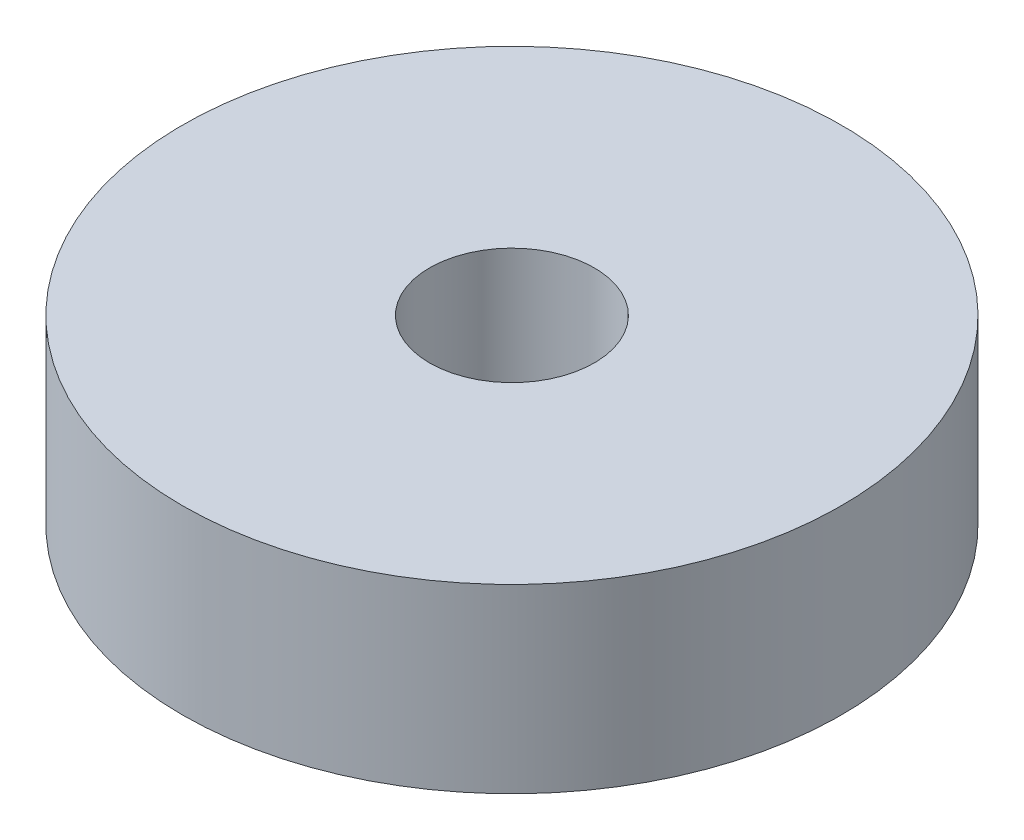
ISO-10303-21;
HEADER;
FILE_DESCRIPTION(('STEP AP214'),'2;1');
FILE_NAME('part.step','',(''),(''),'','','');
FILE_SCHEMA(('AUTOMOTIVE_DESIGN { 1 0 10303 214 1 1 1 1 }'));
ENDSEC;
DATA;
#1=APPLICATION_CONTEXT('core data for automotive mechanical design processes');
#2=APPLICATION_PROTOCOL_DEFINITION('international standard','automotive_design',2000,#1);
#3=PRODUCT_CONTEXT('',#1,'mechanical');
#4=PRODUCT('Part','Part','',(#3));
#5=PRODUCT_RELATED_PRODUCT_CATEGORY('part','',(#4));
#6=PRODUCT_DEFINITION_FORMATION('','',#4);
#7=PRODUCT_DEFINITION_CONTEXT('part definition',#1,'design');
#8=PRODUCT_DEFINITION('design','',#6,#7);
#9=PRODUCT_DEFINITION_SHAPE('','',#8);
#10=(LENGTH_UNIT() NAMED_UNIT(*) SI_UNIT(.MILLI.,.METRE.));
#11=(NAMED_UNIT(*) PLANE_ANGLE_UNIT() SI_UNIT($,.RADIAN.));
#12=(NAMED_UNIT(*) SI_UNIT($,.STERADIAN.) SOLID_ANGLE_UNIT());
#13=UNCERTAINTY_MEASURE_WITH_UNIT(LENGTH_MEASURE(1.E-05),#10,'distance_accuracy_value','');
#14=(GEOMETRIC_REPRESENTATION_CONTEXT(3) GLOBAL_UNCERTAINTY_ASSIGNED_CONTEXT((#13)) GLOBAL_UNIT_ASSIGNED_CONTEXT((#10,
#11,#12)) REPRESENTATION_CONTEXT('',''));
#15=CARTESIAN_POINT('',(0.,0.,0.));
#16=DIRECTION('',(0.,0.,1.));
#17=DIRECTION('',(1.,0.,0.));
#18=AXIS2_PLACEMENT_3D('',#15,#16,#17);
#19=CARTESIAN_POINT('',(0.,13.97,0.));
#20=DIRECTION('',(0.,1.,0.));
#21=DIRECTION('',(0.,0.,1.));
#22=AXIS2_PLACEMENT_3D('',#19,#20,#21);
#23=PLANE('',#22);
#24=CARTESIAN_POINT('',(0.,13.97,0.));
#25=DIRECTION('',(0.,1.,0.));
#26=DIRECTION('',(0.,0.,1.));
#27=AXIS2_PLACEMENT_3D('',#24,#25,#26);
#28=CIRCLE('',#27,25.4);
#29=CARTESIAN_POINT('',(0.,13.97,25.4));
#30=VERTEX_POINT('',#29);
#31=EDGE_CURVE('E10',#30,#30,#28,.T.);
#32=ORIENTED_EDGE('',*,*,#31,.T.);
#33=EDGE_LOOP('',(#32));
#34=FACE_BOUND('',#33,.T.);
#35=CARTESIAN_POINT('',(0.,13.97,0.));
#36=DIRECTION('',(0.,1.,0.));
#37=DIRECTION('',(0.,0.,1.));
#38=AXIS2_PLACEMENT_3D('',#35,#36,#37);
#39=CIRCLE('',#38,6.35);
#40=CARTESIAN_POINT('',(0.,13.97,6.35));
#41=VERTEX_POINT('',#40);
#42=EDGE_CURVE('E42',#41,#41,#39,.T.);
#43=ORIENTED_EDGE('',*,*,#42,.F.);
#44=EDGE_LOOP('',(#43));
#45=FACE_BOUND('',#44,.T.);
#46=ADVANCED_FACE('F31',(#34,#45),#23,.T.);
#47=CARTESIAN_POINT('',(0.,0.,0.));
#48=DIRECTION('',(0.,1.,0.));
#49=DIRECTION('',(0.,0.,1.));
#50=AXIS2_PLACEMENT_3D('',#47,#48,#49);
#51=PLANE('',#50);
#52=CARTESIAN_POINT('',(0.,0.,0.));
#53=DIRECTION('',(0.,1.,0.));
#54=DIRECTION('',(0.,0.,1.));
#55=AXIS2_PLACEMENT_3D('',#52,#53,#54);
#56=CIRCLE('',#55,25.4);
#57=CARTESIAN_POINT('',(0.,0.,25.4));
#58=VERTEX_POINT('',#57);
#59=EDGE_CURVE('E35',#58,#58,#56,.T.);
#60=ORIENTED_EDGE('',*,*,#59,.F.);
#61=EDGE_LOOP('',(#60));
#62=FACE_BOUND('',#61,.T.);
#63=CARTESIAN_POINT('',(0.,0.,0.));
#64=DIRECTION('',(0.,1.,0.));
#65=DIRECTION('',(0.,0.,1.));
#66=AXIS2_PLACEMENT_3D('',#63,#64,#65);
#67=CIRCLE('',#66,6.35);
#68=CARTESIAN_POINT('',(0.,0.,6.35));
#69=VERTEX_POINT('',#68);
#70=EDGE_CURVE('E44',#69,#69,#67,.T.);
#71=ORIENTED_EDGE('',*,*,#70,.T.);
#72=EDGE_LOOP('',(#71));
#73=FACE_BOUND('',#72,.T.);
#74=ADVANCED_FACE('F54',(#62,#73),#51,.F.);
#75=CARTESIAN_POINT('',(0.,13.97,0.));
#76=DIRECTION('',(0.,-1.,0.));
#77=DIRECTION('',(0.,0.,-1.));
#78=AXIS2_PLACEMENT_3D('',#75,#76,#77);
#79=CYLINDRICAL_SURFACE('',#78,25.4);
#80=ORIENTED_EDGE('',*,*,#31,.F.);
#81=EDGE_LOOP('',(#80));
#82=FACE_BOUND('',#81,.T.);
#83=ORIENTED_EDGE('',*,*,#59,.T.);
#84=EDGE_LOOP('',(#83));
#85=FACE_BOUND('',#84,.T.);
#86=ADVANCED_FACE('F33',(#82,#85),#79,.T.);
#87=CARTESIAN_POINT('',(0.,13.97,0.));
#88=DIRECTION('',(0.,-1.,0.));
#89=DIRECTION('',(0.,0.,-1.));
#90=AXIS2_PLACEMENT_3D('',#87,#88,#89);
#91=CYLINDRICAL_SURFACE('',#90,6.35);
#92=ORIENTED_EDGE('',*,*,#42,.T.);
#93=EDGE_LOOP('',(#92));
#94=FACE_BOUND('',#93,.T.);
#95=ORIENTED_EDGE('',*,*,#70,.F.);
#96=EDGE_LOOP('',(#95));
#97=FACE_BOUND('',#96,.T.);
#98=ADVANCED_FACE('F50',(#94,#97),#91,.F.);
#99=CLOSED_SHELL('',(#46,#74,#86,#98));
#100=MANIFOLD_SOLID_BREP('B2',#99);
#101=ADVANCED_BREP_SHAPE_REPRESENTATION('',(#18,#100),#14);
#102=SHAPE_DEFINITION_REPRESENTATION(#9,#101);
ENDSEC;
END-ISO-10303-21;
